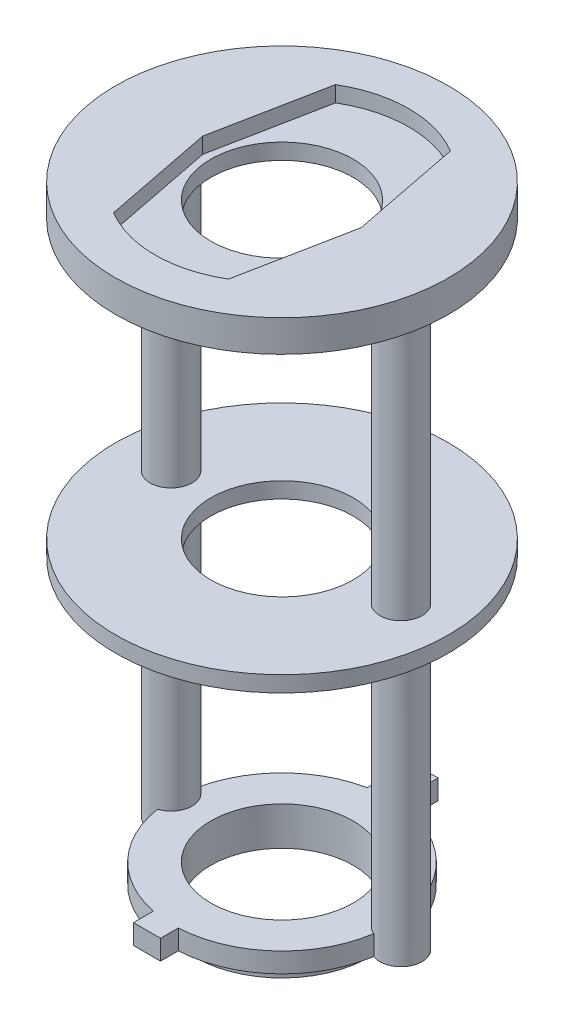
ISO-10303-21;
HEADER;
FILE_DESCRIPTION(('STEP AP214'),'2;1');
FILE_NAME('part.step','',(''),(''),'','','');
FILE_SCHEMA(('AUTOMOTIVE_DESIGN { 1 0 10303 214 1 1 1 1 }'));
ENDSEC;
DATA;
#1=APPLICATION_CONTEXT('core data for automotive mechanical design processes');
#2=APPLICATION_PROTOCOL_DEFINITION('international standard','automotive_design',2000,#1);
#3=PRODUCT_CONTEXT('',#1,'mechanical');
#4=PRODUCT('Part','Part','',(#3));
#5=PRODUCT_RELATED_PRODUCT_CATEGORY('part','',(#4));
#6=PRODUCT_DEFINITION_FORMATION('','',#4);
#7=PRODUCT_DEFINITION_CONTEXT('part definition',#1,'design');
#8=PRODUCT_DEFINITION('design','',#6,#7);
#9=PRODUCT_DEFINITION_SHAPE('','',#8);
#10=(LENGTH_UNIT() NAMED_UNIT(*) SI_UNIT(.MILLI.,.METRE.));
#11=(NAMED_UNIT(*) PLANE_ANGLE_UNIT() SI_UNIT($,.RADIAN.));
#12=(NAMED_UNIT(*) SI_UNIT($,.STERADIAN.) SOLID_ANGLE_UNIT());
#13=UNCERTAINTY_MEASURE_WITH_UNIT(LENGTH_MEASURE(1.E-05),#10,'distance_accuracy_value','');
#14=(GEOMETRIC_REPRESENTATION_CONTEXT(3) GLOBAL_UNCERTAINTY_ASSIGNED_CONTEXT((#13)) GLOBAL_UNIT_ASSIGNED_CONTEXT((#10,
#11,#12)) REPRESENTATION_CONTEXT('',''));
#15=CARTESIAN_POINT('',(0.,0.,0.));
#16=DIRECTION('',(0.,0.,1.));
#17=DIRECTION('',(1.,0.,0.));
#18=AXIS2_PLACEMENT_3D('',#15,#16,#17);
#19=CARTESIAN_POINT('',(-0.0762000000000037,2.5,1.51384));
#20=DIRECTION('',(0.,1.,0.));
#21=DIRECTION('',(0.,0.,1.));
#22=AXIS2_PLACEMENT_3D('',#19,#20,#21);
#23=PLANE('',#22);
#24=CARTESIAN_POINT('',(-0.0762000000000037,2.5,1.51384));
#25=DIRECTION('',(0.,1.,0.));
#26=DIRECTION('',(0.,0.,1.));
#27=AXIS2_PLACEMENT_3D('',#24,#25,#26);
#28=CIRCLE('',#27,8.98);
#29=CARTESIAN_POINT('',(-0.0762000000000037,2.5,10.49384));
#30=VERTEX_POINT('',#29);
#31=EDGE_CURVE('E257',#30,#30,#28,.T.);
#32=ORIENTED_EDGE('',*,*,#31,.F.);
#33=EDGE_LOOP('',(#32));
#34=FACE_BOUND('',#33,.T.);
#35=CARTESIAN_POINT('',(-0.0762000000000037,2.5,1.51384));
#36=DIRECTION('',(0.,1.,0.));
#37=DIRECTION('',(0.,0.,1.));
#38=AXIS2_PLACEMENT_3D('',#35,#36,#37);
#39=CIRCLE('',#38,13.7668);
#40=CARTESIAN_POINT('',(0.597960957999998,2.5,15.2641232422721));
#41=VERTEX_POINT('',#40);
#42=CARTESIAN_POINT('',(13.5388396547462,2.5,3.55233882013443));
#43=VERTEX_POINT('',#42);
#44=EDGE_CURVE('E59',#41,#43,#39,.T.);
#45=ORIENTED_EDGE('',*,*,#44,.T.);
#46=CARTESIAN_POINT('',(14.5034,2.5,1.0795));
#47=DIRECTION('',(0.,1.,0.));
#48=DIRECTION('',(0.,0.,1.));
#49=AXIS2_PLACEMENT_3D('',#46,#47,#48);
#50=CIRCLE('',#49,2.65430000000001);
#51=CARTESIAN_POINT('',(13.3933444870035,2.5,-1.33153406198795));
#52=VERTEX_POINT('',#51);
#53=EDGE_CURVE('E245',#52,#43,#50,.T.);
#54=ORIENTED_EDGE('',*,*,#53,.F.);
#55=CARTESIAN_POINT('',(-0.0762000000000037,2.5,1.51384));
#56=DIRECTION('',(0.,1.,0.));
#57=DIRECTION('',(0.,0.,1.));
#58=AXIS2_PLACEMENT_3D('',#55,#56,#57);
#59=CIRCLE('',#58,13.7668);
#60=CARTESIAN_POINT('',(0.597960957999996,2.5,-12.2364432422721));
#61=VERTEX_POINT('',#60);
#62=EDGE_CURVE('E188',#52,#61,#59,.T.);
#63=ORIENTED_EDGE('',*,*,#62,.T.);
#64=DIRECTION('',(0.,0.,-1.));
#65=VECTOR('',#64,1.);
#66=CARTESIAN_POINT('',(0.597960957999996,2.5,-12.2364432422721));
#67=LINE('',#66,#65);
#68=CARTESIAN_POINT('',(0.597960957999998,2.5,-17.5133));
#69=VERTEX_POINT('',#68);
#70=EDGE_CURVE('E114',#61,#69,#67,.T.);
#71=ORIENTED_EDGE('',*,*,#70,.T.);
#72=DIRECTION('',(-1.,0.,0.));
#73=VECTOR('',#72,1.);
#74=CARTESIAN_POINT('',(0.597960957999998,2.5,-17.5133));
#75=LINE('',#74,#73);
#76=CARTESIAN_POINT('',(-2.819411684,2.5,-17.5133));
#77=VERTEX_POINT('',#76);
#78=EDGE_CURVE('E269',#69,#77,#75,.T.);
#79=ORIENTED_EDGE('',*,*,#78,.T.);
#80=DIRECTION('',(0.,0.,1.));
#81=VECTOR('',#80,1.);
#82=CARTESIAN_POINT('',(-2.819411684,2.5,-17.5133));
#83=LINE('',#82,#81);
#84=CARTESIAN_POINT('',(-2.819411684,2.5,-11.9768816966612));
#85=VERTEX_POINT('',#84);
#86=EDGE_CURVE('E271',#77,#85,#83,.T.);
#87=ORIENTED_EDGE('',*,*,#86,.T.);
#88=CARTESIAN_POINT('',(-0.0762000000000037,2.5,1.51384));
#89=DIRECTION('',(0.,1.,0.));
#90=DIRECTION('',(0.,0.,1.));
#91=AXIS2_PLACEMENT_3D('',#88,#89,#90);
#92=CIRCLE('',#91,13.7668);
#93=CARTESIAN_POINT('',(-13.5330312519173,2.5,-1.39106531642952));
#94=VERTEX_POINT('',#93);
#95=EDGE_CURVE('E273',#85,#94,#92,.T.);
#96=ORIENTED_EDGE('',*,*,#95,.T.);
#97=CARTESIAN_POINT('',(-14.5034,2.5,1.0795));
#98=DIRECTION('',(0.,1.,0.));
#99=DIRECTION('',(0.,0.,1.));
#100=AXIS2_PLACEMENT_3D('',#97,#98,#99);
#101=CIRCLE('',#100,2.6543);
#102=CARTESIAN_POINT('',(-13.6834098116879,2.5,3.60396520694422));
#103=VERTEX_POINT('',#102);
#104=EDGE_CURVE('E251',#103,#94,#101,.T.);
#105=ORIENTED_EDGE('',*,*,#104,.F.);
#106=CARTESIAN_POINT('',(-0.0762000000000037,2.5,1.51384));
#107=DIRECTION('',(0.,1.,0.));
#108=DIRECTION('',(0.,0.,1.));
#109=AXIS2_PLACEMENT_3D('',#106,#107,#108);
#110=CIRCLE('',#109,13.7668);
#111=CARTESIAN_POINT('',(-2.81941168400001,2.5,15.0045616966612));
#112=VERTEX_POINT('',#111);
#113=EDGE_CURVE('E275',#103,#112,#110,.T.);
#114=ORIENTED_EDGE('',*,*,#113,.T.);
#115=DIRECTION('',(0.,0.,1.));
#116=VECTOR('',#115,1.);
#117=CARTESIAN_POINT('',(-2.81941168400001,2.5,15.0045616966612));
#118=LINE('',#117,#116);
#119=CARTESIAN_POINT('',(-2.819411684,2.5,17.5133));
#120=VERTEX_POINT('',#119);
#121=EDGE_CURVE('E142',#112,#120,#118,.T.);
#122=ORIENTED_EDGE('',*,*,#121,.T.);
#123=DIRECTION('',(1.,0.,0.));
#124=VECTOR('',#123,1.);
#125=CARTESIAN_POINT('',(-2.819411684,2.5,17.5133));
#126=LINE('',#125,#124);
#127=CARTESIAN_POINT('',(0.597960957999998,2.5,17.5133));
#128=VERTEX_POINT('',#127);
#129=EDGE_CURVE('E136',#120,#128,#126,.T.);
#130=ORIENTED_EDGE('',*,*,#129,.T.);
#131=DIRECTION('',(0.,0.,-1.));
#132=VECTOR('',#131,1.);
#133=CARTESIAN_POINT('',(0.597960957999998,2.5,17.5133));
#134=LINE('',#133,#132);
#135=EDGE_CURVE('E139',#128,#41,#134,.T.);
#136=ORIENTED_EDGE('',*,*,#135,.T.);
#137=EDGE_LOOP('',(#45,#54,#63,#71,#79,#87,#96,#105,#114,#122,#130,#136));
#138=FACE_BOUND('',#137,.T.);
#139=ADVANCED_FACE('F35',(#34,#138),#23,.T.);
#140=CARTESIAN_POINT('',(-0.0762000000000037,2.5,1.51384));
#141=DIRECTION('',(0.,-1.,0.));
#142=DIRECTION('',(0.,0.,-1.));
#143=AXIS2_PLACEMENT_3D('',#140,#141,#142);
#144=CYLINDRICAL_SURFACE('',#143,13.7668);
#145=CARTESIAN_POINT('',(-0.0762000000000037,0.,1.51384));
#146=DIRECTION('',(0.,1.,0.));
#147=DIRECTION('',(0.,0.,1.));
#148=AXIS2_PLACEMENT_3D('',#145,#146,#147);
#149=CIRCLE('',#148,13.7668);
#150=CARTESIAN_POINT('',(13.3933444870035,0.,-1.33153406198795));
#151=VERTEX_POINT('',#150);
#152=CARTESIAN_POINT('',(0.597960957999996,0.,-12.2364432422721));
#153=VERTEX_POINT('',#152);
#154=EDGE_CURVE('E164',#151,#153,#149,.T.);
#155=ORIENTED_EDGE('',*,*,#154,.T.);
#156=DIRECTION('',(0.,-1.,0.));
#157=VECTOR('',#156,1.);
#158=CARTESIAN_POINT('',(0.597960957999996,2.5,-12.2364432422721));
#159=LINE('',#158,#157);
#160=EDGE_CURVE('E212',#61,#153,#159,.T.);
#161=ORIENTED_EDGE('',*,*,#160,.F.);
#162=ORIENTED_EDGE('',*,*,#62,.F.);
#163=DIRECTION('',(0.,-1.,0.));
#164=VECTOR('',#163,1.);
#165=CARTESIAN_POINT('',(13.3933444870035,2.5,-1.33153406198795));
#166=LINE('',#165,#164);
#167=EDGE_CURVE('E160',#52,#151,#166,.T.);
#168=ORIENTED_EDGE('',*,*,#167,.T.);
#169=EDGE_LOOP('',(#155,#161,#162,#168));
#170=FACE_BOUND('',#169,.T.);
#171=ADVANCED_FACE('F37',(#170),#144,.T.);
#172=CARTESIAN_POINT('',(0.597960957999996,2.5,-12.2364432422721));
#173=DIRECTION('',(-1.,0.,0.));
#174=DIRECTION('',(0.,0.,1.));
#175=AXIS2_PLACEMENT_3D('',#172,#173,#174);
#176=PLANE('',#175);
#177=DIRECTION('',(0.,0.,-1.));
#178=VECTOR('',#177,1.);
#179=CARTESIAN_POINT('',(0.597960957999996,0.,-12.2364432422721));
#180=LINE('',#179,#178);
#181=CARTESIAN_POINT('',(0.597960957999998,0.,-17.5133));
#182=VERTEX_POINT('',#181);
#183=EDGE_CURVE('E167',#153,#182,#180,.T.);
#184=ORIENTED_EDGE('',*,*,#183,.T.);
#185=DIRECTION('',(0.,-1.,0.));
#186=VECTOR('',#185,1.);
#187=CARTESIAN_POINT('',(0.597960957999998,2.5,-17.5133));
#188=LINE('',#187,#186);
#189=EDGE_CURVE('E209',#69,#182,#188,.T.);
#190=ORIENTED_EDGE('',*,*,#189,.F.);
#191=ORIENTED_EDGE('',*,*,#70,.F.);
#192=ORIENTED_EDGE('',*,*,#160,.T.);
#193=EDGE_LOOP('',(#184,#190,#191,#192));
#194=FACE_BOUND('',#193,.T.);
#195=ADVANCED_FACE('F423',(#194),#176,.F.);
#196=CARTESIAN_POINT('',(0.597960957999998,2.5,-17.5133));
#197=DIRECTION('',(0.,0.,1.));
#198=DIRECTION('',(1.,0.,0.));
#199=AXIS2_PLACEMENT_3D('',#196,#197,#198);
#200=PLANE('',#199);
#201=DIRECTION('',(-1.,0.,0.));
#202=VECTOR('',#201,1.);
#203=CARTESIAN_POINT('',(0.597960957999998,0.,-17.5133));
#204=LINE('',#203,#202);
#205=CARTESIAN_POINT('',(-2.819411684,0.,-17.5133));
#206=VERTEX_POINT('',#205);
#207=EDGE_CURVE('E170',#182,#206,#204,.T.);
#208=ORIENTED_EDGE('',*,*,#207,.T.);
#209=DIRECTION('',(0.,-1.,0.));
#210=VECTOR('',#209,1.);
#211=CARTESIAN_POINT('',(-2.819411684,2.5,-17.5133));
#212=LINE('',#211,#210);
#213=EDGE_CURVE('E206',#77,#206,#212,.T.);
#214=ORIENTED_EDGE('',*,*,#213,.F.);
#215=ORIENTED_EDGE('',*,*,#78,.F.);
#216=ORIENTED_EDGE('',*,*,#189,.T.);
#217=EDGE_LOOP('',(#208,#214,#215,#216));
#218=FACE_BOUND('',#217,.T.);
#219=ADVANCED_FACE('F457',(#218),#200,.F.);
#220=CARTESIAN_POINT('',(-2.819411684,2.5,-17.5133));
#221=DIRECTION('',(1.,0.,0.));
#222=DIRECTION('',(0.,0.,-1.));
#223=AXIS2_PLACEMENT_3D('',#220,#221,#222);
#224=PLANE('',#223);
#225=DIRECTION('',(0.,0.,1.));
#226=VECTOR('',#225,1.);
#227=CARTESIAN_POINT('',(-2.819411684,0.,-17.5133));
#228=LINE('',#227,#226);
#229=CARTESIAN_POINT('',(-2.819411684,0.,-11.9768816966612));
#230=VERTEX_POINT('',#229);
#231=EDGE_CURVE('E172',#206,#230,#228,.T.);
#232=ORIENTED_EDGE('',*,*,#231,.T.);
#233=DIRECTION('',(0.,-1.,0.));
#234=VECTOR('',#233,1.);
#235=CARTESIAN_POINT('',(-2.819411684,2.5,-11.9768816966612));
#236=LINE('',#235,#234);
#237=EDGE_CURVE('E203',#85,#230,#236,.T.);
#238=ORIENTED_EDGE('',*,*,#237,.F.);
#239=ORIENTED_EDGE('',*,*,#86,.F.);
#240=ORIENTED_EDGE('',*,*,#213,.T.);
#241=EDGE_LOOP('',(#232,#238,#239,#240));
#242=FACE_BOUND('',#241,.T.);
#243=ADVANCED_FACE('F453',(#242),#224,.F.);
#244=CARTESIAN_POINT('',(-0.0762000000000037,2.5,1.51384));
#245=DIRECTION('',(0.,-1.,0.));
#246=DIRECTION('',(0.,0.,-1.));
#247=AXIS2_PLACEMENT_3D('',#244,#245,#246);
#248=CYLINDRICAL_SURFACE('',#247,13.7668);
#249=CARTESIAN_POINT('',(-0.0762000000000037,0.,1.51384));
#250=DIRECTION('',(0.,1.,0.));
#251=DIRECTION('',(0.,0.,1.));
#252=AXIS2_PLACEMENT_3D('',#249,#250,#251);
#253=CIRCLE('',#252,13.7668);
#254=CARTESIAN_POINT('',(-13.5330312519173,0.,-1.39106531642952));
#255=VERTEX_POINT('',#254);
#256=EDGE_CURVE('E174',#230,#255,#253,.T.);
#257=ORIENTED_EDGE('',*,*,#256,.T.);
#258=DIRECTION('',(0.,-1.,0.));
#259=VECTOR('',#258,1.);
#260=CARTESIAN_POINT('',(-13.5330312519173,2.5,-1.39106531642952));
#261=LINE('',#260,#259);
#262=EDGE_CURVE('E200',#94,#255,#261,.T.);
#263=ORIENTED_EDGE('',*,*,#262,.F.);
#264=ORIENTED_EDGE('',*,*,#95,.F.);
#265=ORIENTED_EDGE('',*,*,#237,.T.);
#266=EDGE_LOOP('',(#257,#263,#264,#265));
#267=FACE_BOUND('',#266,.T.);
#268=ADVANCED_FACE('F448',(#267),#248,.T.);
#269=CARTESIAN_POINT('',(-14.5034,2.5,1.0795));
#270=DIRECTION('',(0.,-1.,0.));
#271=DIRECTION('',(0.,0.,-1.));
#272=AXIS2_PLACEMENT_3D('',#269,#270,#271);
#273=CYLINDRICAL_SURFACE('',#272,2.6543);
#274=CARTESIAN_POINT('',(-14.5034,35.805,1.0795));
#275=DIRECTION('',(0.,-1.,0.));
#276=DIRECTION('',(0.,0.,-1.));
#277=AXIS2_PLACEMENT_3D('',#274,#275,#276);
#278=CIRCLE('',#277,2.6543);
#279=CARTESIAN_POINT('',(-14.5034,35.805,-1.5748));
#280=VERTEX_POINT('',#279);
#281=EDGE_CURVE('E218',#280,#280,#278,.T.);
#282=ORIENTED_EDGE('',*,*,#281,.T.);
#283=EDGE_LOOP('',(#282));
#284=FACE_BOUND('',#283,.T.);
#285=CARTESIAN_POINT('',(-14.5034,0.,1.0795));
#286=DIRECTION('',(0.,1.,0.));
#287=DIRECTION('',(0.,0.,1.));
#288=AXIS2_PLACEMENT_3D('',#285,#286,#287);
#289=CIRCLE('',#288,2.6543);
#290=CARTESIAN_POINT('',(-13.6834098116879,0.,3.60396520694422));
#291=VERTEX_POINT('',#290);
#292=EDGE_CURVE('E176',#255,#291,#289,.T.);
#293=ORIENTED_EDGE('',*,*,#292,.T.);
#294=DIRECTION('',(0.,-1.,0.));
#295=VECTOR('',#294,1.);
#296=CARTESIAN_POINT('',(-13.6834098116879,2.5,3.60396520694422));
#297=LINE('',#296,#295);
#298=EDGE_CURVE('E197',#103,#291,#297,.T.);
#299=ORIENTED_EDGE('',*,*,#298,.F.);
#300=ORIENTED_EDGE('',*,*,#104,.T.);
#301=ORIENTED_EDGE('',*,*,#262,.T.);
#302=EDGE_LOOP('',(#293,#299,#300,#301));
#303=FACE_BOUND('',#302,.T.);
#304=ADVANCED_FACE('F445',(#284,#303),#273,.T.);
#305=CARTESIAN_POINT('',(-0.0762000000000037,2.5,1.51384));
#306=DIRECTION('',(0.,-1.,0.));
#307=DIRECTION('',(0.,0.,-1.));
#308=AXIS2_PLACEMENT_3D('',#305,#306,#307);
#309=CYLINDRICAL_SURFACE('',#308,13.7668);
#310=CARTESIAN_POINT('',(-0.0762000000000037,0.,1.51384));
#311=DIRECTION('',(0.,1.,0.));
#312=DIRECTION('',(0.,0.,1.));
#313=AXIS2_PLACEMENT_3D('',#310,#311,#312);
#314=CIRCLE('',#313,13.7668);
#315=CARTESIAN_POINT('',(-2.81941168400001,0.,15.0045616966612));
#316=VERTEX_POINT('',#315);
#317=EDGE_CURVE('E178',#291,#316,#314,.T.);
#318=ORIENTED_EDGE('',*,*,#317,.T.);
#319=DIRECTION('',(0.,-1.,0.));
#320=VECTOR('',#319,1.);
#321=CARTESIAN_POINT('',(-2.81941168400001,2.5,15.0045616966612));
#322=LINE('',#321,#320);
#323=EDGE_CURVE('E194',#112,#316,#322,.T.);
#324=ORIENTED_EDGE('',*,*,#323,.F.);
#325=ORIENTED_EDGE('',*,*,#113,.F.);
#326=ORIENTED_EDGE('',*,*,#298,.T.);
#327=EDGE_LOOP('',(#318,#324,#325,#326));
#328=FACE_BOUND('',#327,.T.);
#329=ADVANCED_FACE('F281',(#328),#309,.T.);
#330=CARTESIAN_POINT('',(-2.81941168400001,2.5,15.0045616966612));
#331=DIRECTION('',(1.,0.,0.));
#332=DIRECTION('',(0.,0.,-1.));
#333=AXIS2_PLACEMENT_3D('',#330,#331,#332);
#334=PLANE('',#333);
#335=DIRECTION('',(0.,0.,1.));
#336=VECTOR('',#335,1.);
#337=CARTESIAN_POINT('',(-2.81941168400001,0.,15.0045616966612));
#338=LINE('',#337,#336);
#339=CARTESIAN_POINT('',(-2.819411684,0.,17.5133));
#340=VERTEX_POINT('',#339);
#341=EDGE_CURVE('E180',#316,#340,#338,.T.);
#342=ORIENTED_EDGE('',*,*,#341,.T.);
#343=DIRECTION('',(0.,-1.,0.));
#344=VECTOR('',#343,1.);
#345=CARTESIAN_POINT('',(-2.819411684,2.5,17.5133));
#346=LINE('',#345,#344);
#347=EDGE_CURVE('E154',#120,#340,#346,.T.);
#348=ORIENTED_EDGE('',*,*,#347,.F.);
#349=ORIENTED_EDGE('',*,*,#121,.F.);
#350=ORIENTED_EDGE('',*,*,#323,.T.);
#351=EDGE_LOOP('',(#342,#348,#349,#350));
#352=FACE_BOUND('',#351,.T.);
#353=ADVANCED_FACE('F285',(#352),#334,.F.);
#354=CARTESIAN_POINT('',(-2.819411684,2.5,17.5133));
#355=DIRECTION('',(0.,0.,-1.));
#356=DIRECTION('',(-1.,0.,0.));
#357=AXIS2_PLACEMENT_3D('',#354,#355,#356);
#358=PLANE('',#357);
#359=DIRECTION('',(1.,0.,0.));
#360=VECTOR('',#359,1.);
#361=CARTESIAN_POINT('',(-2.819411684,0.,17.5133));
#362=LINE('',#361,#360);
#363=CARTESIAN_POINT('',(0.597960957999998,0.,17.5133));
#364=VERTEX_POINT('',#363);
#365=EDGE_CURVE('E151',#340,#364,#362,.T.);
#366=ORIENTED_EDGE('',*,*,#365,.T.);
#367=DIRECTION('',(0.,-1.,0.));
#368=VECTOR('',#367,1.);
#369=CARTESIAN_POINT('',(0.597960957999998,2.5,17.5133));
#370=LINE('',#369,#368);
#371=EDGE_CURVE('E148',#128,#364,#370,.T.);
#372=ORIENTED_EDGE('',*,*,#371,.F.);
#373=ORIENTED_EDGE('',*,*,#129,.F.);
#374=ORIENTED_EDGE('',*,*,#347,.T.);
#375=EDGE_LOOP('',(#366,#372,#373,#374));
#376=FACE_BOUND('',#375,.T.);
#377=ADVANCED_FACE('F149',(#376),#358,.F.);
#378=CARTESIAN_POINT('',(0.597960957999998,2.5,17.5133));
#379=DIRECTION('',(-1.,0.,0.));
#380=DIRECTION('',(0.,0.,1.));
#381=AXIS2_PLACEMENT_3D('',#378,#379,#380);
#382=PLANE('',#381);
#383=DIRECTION('',(0.,0.,-1.));
#384=VECTOR('',#383,1.);
#385=CARTESIAN_POINT('',(0.597960957999998,0.,17.5133));
#386=LINE('',#385,#384);
#387=CARTESIAN_POINT('',(0.597960957999998,0.,15.2641232422721));
#388=VERTEX_POINT('',#387);
#389=EDGE_CURVE('E183',#364,#388,#386,.T.);
#390=ORIENTED_EDGE('',*,*,#389,.T.);
#391=DIRECTION('',(0.,-1.,0.));
#392=VECTOR('',#391,1.);
#393=CARTESIAN_POINT('',(0.597960957999998,2.5,15.2641232422721));
#394=LINE('',#393,#392);
#395=EDGE_CURVE('E155',#41,#388,#394,.T.);
#396=ORIENTED_EDGE('',*,*,#395,.F.);
#397=ORIENTED_EDGE('',*,*,#135,.F.);
#398=ORIENTED_EDGE('',*,*,#371,.T.);
#399=EDGE_LOOP('',(#390,#396,#397,#398));
#400=FACE_BOUND('',#399,.T.);
#401=ADVANCED_FACE('F157',(#400),#382,.F.);
#402=CARTESIAN_POINT('',(-0.0762000000000037,2.5,1.51384));
#403=DIRECTION('',(0.,-1.,0.));
#404=DIRECTION('',(0.,0.,-1.));
#405=AXIS2_PLACEMENT_3D('',#402,#403,#404);
#406=CYLINDRICAL_SURFACE('',#405,13.7668);
#407=CARTESIAN_POINT('',(-0.0762000000000037,0.,1.51384));
#408=DIRECTION('',(0.,1.,0.));
#409=DIRECTION('',(0.,0.,1.));
#410=AXIS2_PLACEMENT_3D('',#407,#408,#409);
#411=CIRCLE('',#410,13.7668);
#412=CARTESIAN_POINT('',(13.5388396547462,0.,3.55233882013443));
#413=VERTEX_POINT('',#412);
#414=EDGE_CURVE('E185',#388,#413,#411,.T.);
#415=ORIENTED_EDGE('',*,*,#414,.T.);
#416=DIRECTION('',(0.,-1.,0.));
#417=VECTOR('',#416,1.);
#418=CARTESIAN_POINT('',(13.5388396547462,2.5,3.55233882013443));
#419=LINE('',#418,#417);
#420=EDGE_CURVE('E190',#43,#413,#419,.T.);
#421=ORIENTED_EDGE('',*,*,#420,.F.);
#422=ORIENTED_EDGE('',*,*,#44,.F.);
#423=ORIENTED_EDGE('',*,*,#395,.T.);
#424=EDGE_LOOP('',(#415,#421,#422,#423));
#425=FACE_BOUND('',#424,.T.);
#426=ADVANCED_FACE('F291',(#425),#406,.T.);
#427=CARTESIAN_POINT('',(14.5034,2.5,1.0795));
#428=DIRECTION('',(0.,-1.,0.));
#429=DIRECTION('',(0.,0.,-1.));
#430=AXIS2_PLACEMENT_3D('',#427,#428,#429);
#431=CYLINDRICAL_SURFACE('',#430,2.6543);
#432=CARTESIAN_POINT('',(14.5034,35.805,1.0795));
#433=DIRECTION('',(0.,-1.,0.));
#434=DIRECTION('',(0.,0.,-1.));
#435=AXIS2_PLACEMENT_3D('',#432,#433,#434);
#436=CIRCLE('',#435,2.6543);
#437=CARTESIAN_POINT('',(14.5034,35.805,-1.57480000000001));
#438=VERTEX_POINT('',#437);
#439=EDGE_CURVE('E216',#438,#438,#436,.T.);
#440=ORIENTED_EDGE('',*,*,#439,.T.);
#441=EDGE_LOOP('',(#440));
#442=FACE_BOUND('',#441,.T.);
#443=CARTESIAN_POINT('',(14.5034,0.,1.0795));
#444=DIRECTION('',(0.,1.,0.));
#445=DIRECTION('',(0.,0.,1.));
#446=AXIS2_PLACEMENT_3D('',#443,#444,#445);
#447=CIRCLE('',#446,2.6543);
#448=EDGE_CURVE('E105',#413,#151,#447,.T.);
#449=ORIENTED_EDGE('',*,*,#448,.T.);
#450=ORIENTED_EDGE('',*,*,#167,.F.);
#451=ORIENTED_EDGE('',*,*,#53,.T.);
#452=ORIENTED_EDGE('',*,*,#420,.T.);
#453=EDGE_LOOP('',(#449,#450,#451,#452));
#454=FACE_BOUND('',#453,.T.);
#455=ADVANCED_FACE('F292',(#442,#454),#431,.T.);
#456=CARTESIAN_POINT('',(-0.0762000000000037,0.,1.51384));
#457=DIRECTION('',(0.,1.,0.));
#458=DIRECTION('',(0.,0.,1.));
#459=AXIS2_PLACEMENT_3D('',#456,#457,#458);
#460=PLANE('',#459);
#461=CARTESIAN_POINT('',(-0.0762000000000054,0.,1.51384));
#462=DIRECTION('',(0.,1.,0.));
#463=DIRECTION('',(0.,0.,1.));
#464=AXIS2_PLACEMENT_3D('',#461,#462,#463);
#465=CIRCLE('',#464,11.0744);
#466=CARTESIAN_POINT('',(-0.0762000000000054,0.,12.58824));
#467=VERTEX_POINT('',#466);
#468=EDGE_CURVE('E11',#467,#467,#465,.F.);
#469=ORIENTED_EDGE('',*,*,#468,.F.);
#470=EDGE_LOOP('',(#469));
#471=FACE_BOUND('',#470,.T.);
#472=CARTESIAN_POINT('',(14.5034,0.,1.0795));
#473=DIRECTION('',(0.,1.,0.));
#474=DIRECTION('',(0.,0.,1.));
#475=AXIS2_PLACEMENT_3D('',#472,#473,#474);
#476=CIRCLE('',#475,1.715);
#477=CARTESIAN_POINT('',(14.5034,0.,2.7945));
#478=VERTEX_POINT('',#477);
#479=EDGE_CURVE('E260',#478,#478,#476,.F.);
#480=ORIENTED_EDGE('',*,*,#479,.F.);
#481=EDGE_LOOP('',(#480));
#482=FACE_BOUND('',#481,.T.);
#483=CARTESIAN_POINT('',(-14.5034,0.,1.0795));
#484=DIRECTION('',(0.,1.,0.));
#485=DIRECTION('',(0.,0.,1.));
#486=AXIS2_PLACEMENT_3D('',#483,#484,#485);
#487=CIRCLE('',#486,1.715);
#488=CARTESIAN_POINT('',(-14.5034,0.,2.7945));
#489=VERTEX_POINT('',#488);
#490=EDGE_CURVE('E168',#489,#489,#487,.F.);
#491=ORIENTED_EDGE('',*,*,#490,.F.);
#492=EDGE_LOOP('',(#491));
#493=FACE_BOUND('',#492,.T.);
#494=ORIENTED_EDGE('',*,*,#154,.F.);
#495=ORIENTED_EDGE('',*,*,#448,.F.);
#496=ORIENTED_EDGE('',*,*,#414,.F.);
#497=ORIENTED_EDGE('',*,*,#389,.F.);
#498=ORIENTED_EDGE('',*,*,#365,.F.);
#499=ORIENTED_EDGE('',*,*,#341,.F.);
#500=ORIENTED_EDGE('',*,*,#317,.F.);
#501=ORIENTED_EDGE('',*,*,#292,.F.);
#502=ORIENTED_EDGE('',*,*,#256,.F.);
#503=ORIENTED_EDGE('',*,*,#231,.F.);
#504=ORIENTED_EDGE('',*,*,#207,.F.);
#505=ORIENTED_EDGE('',*,*,#183,.F.);
#506=EDGE_LOOP('',(#494,#495,#496,#497,#498,#499,#500,#501,#502,#503,#504,#505));
#507=FACE_BOUND('',#506,.T.);
#508=ADVANCED_FACE('F288',(#471,#482,#493,#507),#460,.F.);
#509=CARTESIAN_POINT('',(-14.5034,-0.00100000000000013,1.0795));
#510=DIRECTION('',(0.,1.,0.));
#511=DIRECTION('',(0.,0.,1.));
#512=AXIS2_PLACEMENT_3D('',#509,#510,#511);
#513=CYLINDRICAL_SURFACE('',#512,1.715);
#514=ORIENTED_EDGE('',*,*,#490,.T.);
#515=EDGE_LOOP('',(#514));
#516=FACE_BOUND('',#515,.T.);
#517=CARTESIAN_POINT('',(-14.5034,15.,1.0795));
#518=DIRECTION('',(0.,-1.,0.));
#519=DIRECTION('',(0.,0.,-1.));
#520=AXIS2_PLACEMENT_3D('',#517,#518,#519);
#521=CIRCLE('',#520,1.715);
#522=CARTESIAN_POINT('',(-14.5034,15.,-0.635500000000002));
#523=VERTEX_POINT('',#522);
#524=EDGE_CURVE('E391',#523,#523,#521,.T.);
#525=ORIENTED_EDGE('',*,*,#524,.F.);
#526=EDGE_LOOP('',(#525));
#527=FACE_BOUND('',#526,.T.);
#528=ADVANCED_FACE('F427',(#516,#527),#513,.F.);
#529=CARTESIAN_POINT('',(-0.0762000000000037,-0.00100000000000013,1.51384));
#530=DIRECTION('',(0.,1.,0.));
#531=DIRECTION('',(0.,0.,1.));
#532=AXIS2_PLACEMENT_3D('',#529,#530,#531);
#533=CYLINDRICAL_SURFACE('',#532,8.98);
#534=ORIENTED_EDGE('',*,*,#31,.T.);
#535=EDGE_LOOP('',(#534));
#536=FACE_BOUND('',#535,.T.);
#537=CARTESIAN_POINT('',(-0.0762000000000037,-2.35,1.51384));
#538=DIRECTION('',(0.,-1.,0.));
#539=DIRECTION('',(0.,0.,-1.));
#540=AXIS2_PLACEMENT_3D('',#537,#538,#539);
#541=CIRCLE('',#540,8.98);
#542=CARTESIAN_POINT('',(-0.0762000000000037,-2.35,-7.46616));
#543=VERTEX_POINT('',#542);
#544=EDGE_CURVE('E768',#543,#543,#541,.F.);
#545=ORIENTED_EDGE('',*,*,#544,.F.);
#546=EDGE_LOOP('',(#545));
#547=FACE_BOUND('',#546,.T.);
#548=ADVANCED_FACE('F536',(#536,#547),#533,.F.);
#549=CARTESIAN_POINT('',(14.5034,-0.00100000000000013,1.0795));
#550=DIRECTION('',(0.,1.,0.));
#551=DIRECTION('',(0.,0.,1.));
#552=AXIS2_PLACEMENT_3D('',#549,#550,#551);
#553=CYLINDRICAL_SURFACE('',#552,1.715);
#554=ORIENTED_EDGE('',*,*,#479,.T.);
#555=EDGE_LOOP('',(#554));
#556=FACE_BOUND('',#555,.T.);
#557=CARTESIAN_POINT('',(14.5034,15.,1.0795));
#558=DIRECTION('',(0.,-1.,0.));
#559=DIRECTION('',(0.,0.,-1.));
#560=AXIS2_PLACEMENT_3D('',#557,#558,#559);
#561=CIRCLE('',#560,1.715);
#562=CARTESIAN_POINT('',(14.5034,15.,-0.635500000000003));
#563=VERTEX_POINT('',#562);
#564=EDGE_CURVE('E381',#563,#563,#561,.T.);
#565=ORIENTED_EDGE('',*,*,#564,.F.);
#566=EDGE_LOOP('',(#565));
#567=FACE_BOUND('',#566,.T.);
#568=ADVANCED_FACE('F542',(#556,#567),#553,.F.);
#569=CARTESIAN_POINT('',(-0.0762000000000037,35.805,1.51384));
#570=DIRECTION('',(0.,-1.,0.));
#571=DIRECTION('',(0.,0.,-1.));
#572=AXIS2_PLACEMENT_3D('',#569,#570,#571);
#573=PLANE('',#572);
#574=ORIENTED_EDGE('',*,*,#281,.F.);
#575=EDGE_LOOP('',(#574));
#576=FACE_BOUND('',#575,.T.);
#577=ORIENTED_EDGE('',*,*,#439,.F.);
#578=EDGE_LOOP('',(#577));
#579=FACE_BOUND('',#578,.T.);
#580=CARTESIAN_POINT('',(-0.0762000000000037,35.805,1.51384));
#581=DIRECTION('',(0.,-1.,0.));
#582=DIRECTION('',(0.,0.,-1.));
#583=AXIS2_PLACEMENT_3D('',#580,#581,#582);
#584=CIRCLE('',#583,21.);
#585=CARTESIAN_POINT('',(-0.0762000000000037,35.805,-19.48616));
#586=VERTEX_POINT('',#585);
#587=EDGE_CURVE('E219',#586,#586,#584,.T.);
#588=ORIENTED_EDGE('',*,*,#587,.T.);
#589=EDGE_LOOP('',(#588));
#590=FACE_BOUND('',#589,.T.);
#591=CARTESIAN_POINT('',(-0.0762000000000037,35.805,1.51384));
#592=DIRECTION('',(0.,-1.,0.));
#593=DIRECTION('',(0.,0.,-1.));
#594=AXIS2_PLACEMENT_3D('',#591,#592,#593);
#595=CIRCLE('',#594,8.98);
#596=CARTESIAN_POINT('',(-0.0762000000000037,35.805,-7.46616));
#597=VERTEX_POINT('',#596);
#598=EDGE_CURVE('E231',#597,#597,#595,.T.);
#599=ORIENTED_EDGE('',*,*,#598,.F.);
#600=EDGE_LOOP('',(#599));
#601=FACE_BOUND('',#600,.T.);
#602=ADVANCED_FACE('F545',(#576,#579,#590,#601),#573,.T.);
#603=CARTESIAN_POINT('',(-0.0762000000000037,37.805,1.51384));
#604=DIRECTION('',(0.,-1.,0.));
#605=DIRECTION('',(0.,0.,-1.));
#606=AXIS2_PLACEMENT_3D('',#603,#604,#605);
#607=PLANE('',#606);
#608=CARTESIAN_POINT('',(-14.5034,37.805,1.0795));
#609=DIRECTION('',(0.,-1.,0.));
#610=DIRECTION('',(0.,0.,-1.));
#611=AXIS2_PLACEMENT_3D('',#608,#609,#610);
#612=CIRCLE('',#611,2.6543);
#613=CARTESIAN_POINT('',(-14.5034,37.805,-1.5748));
#614=VERTEX_POINT('',#613);
#615=EDGE_CURVE('E43',#614,#614,#612,.T.);
#616=ORIENTED_EDGE('',*,*,#615,.T.);
#617=EDGE_LOOP('',(#616));
#618=FACE_BOUND('',#617,.T.);
#619=CARTESIAN_POINT('',(14.5034,37.805,1.0795));
#620=DIRECTION('',(0.,-1.,0.));
#621=DIRECTION('',(0.,0.,-1.));
#622=AXIS2_PLACEMENT_3D('',#619,#620,#621);
#623=CIRCLE('',#622,2.6543);
#624=CARTESIAN_POINT('',(14.5034,37.805,-1.57480000000001));
#625=VERTEX_POINT('',#624);
#626=EDGE_CURVE('E214',#625,#625,#623,.T.);
#627=ORIENTED_EDGE('',*,*,#626,.T.);
#628=EDGE_LOOP('',(#627));
#629=FACE_BOUND('',#628,.T.);
#630=CARTESIAN_POINT('',(-0.0762000000000037,37.805,1.51384));
#631=DIRECTION('',(0.,-1.,0.));
#632=DIRECTION('',(0.,0.,-1.));
#633=AXIS2_PLACEMENT_3D('',#630,#631,#632);
#634=CIRCLE('',#633,21.);
#635=CARTESIAN_POINT('',(-0.0762000000000037,37.805,-19.48616));
#636=VERTEX_POINT('',#635);
#637=EDGE_CURVE('E226',#636,#636,#634,.T.);
#638=ORIENTED_EDGE('',*,*,#637,.F.);
#639=EDGE_LOOP('',(#638));
#640=FACE_BOUND('',#639,.T.);
#641=CARTESIAN_POINT('',(-0.0762000000000037,37.805,1.51384));
#642=DIRECTION('',(0.,-1.,0.));
#643=DIRECTION('',(0.,0.,-1.));
#644=AXIS2_PLACEMENT_3D('',#641,#642,#643);
#645=CIRCLE('',#644,8.98);
#646=CARTESIAN_POINT('',(-0.0762000000000037,37.805,-7.46616));
#647=VERTEX_POINT('',#646);
#648=EDGE_CURVE('E234',#647,#647,#645,.T.);
#649=ORIENTED_EDGE('',*,*,#648,.T.);
#650=EDGE_LOOP('',(#649));
#651=FACE_BOUND('',#650,.T.);
#652=ADVANCED_FACE('F399',(#618,#629,#640,#651),#607,.F.);
#653=CARTESIAN_POINT('',(-0.0762000000000037,35.805,1.51384));
#654=DIRECTION('',(0.,1.,0.));
#655=DIRECTION('',(0.,0.,1.));
#656=AXIS2_PLACEMENT_3D('',#653,#654,#655);
#657=CYLINDRICAL_SURFACE('',#656,21.);
#658=ORIENTED_EDGE('',*,*,#587,.F.);
#659=EDGE_LOOP('',(#658));
#660=FACE_BOUND('',#659,.T.);
#661=ORIENTED_EDGE('',*,*,#637,.T.);
#662=EDGE_LOOP('',(#661));
#663=FACE_BOUND('',#662,.T.);
#664=ADVANCED_FACE('F404',(#660,#663),#657,.T.);
#665=CARTESIAN_POINT('',(-0.0762000000000037,35.805,1.51384));
#666=DIRECTION('',(0.,1.,0.));
#667=DIRECTION('',(0.,0.,1.));
#668=AXIS2_PLACEMENT_3D('',#665,#666,#667);
#669=CYLINDRICAL_SURFACE('',#668,8.98);
#670=ORIENTED_EDGE('',*,*,#598,.T.);
#671=EDGE_LOOP('',(#670));
#672=FACE_BOUND('',#671,.T.);
#673=ORIENTED_EDGE('',*,*,#648,.F.);
#674=EDGE_LOOP('',(#673));
#675=FACE_BOUND('',#674,.T.);
#676=ADVANCED_FACE('F401',(#672,#675),#669,.F.);
#677=CARTESIAN_POINT('',(-0.0762000000000037,76.805,1.51384));
#678=DIRECTION('',(0.,1.,0.));
#679=DIRECTION('',(0.,0.,1.));
#680=AXIS2_PLACEMENT_3D('',#677,#678,#679);
#681=PLANE('',#680);
#682=CARTESIAN_POINT('',(-0.0762000000000017,76.805,-0.345535000000039));
#683=DIRECTION('',(0.,1.,0.));
#684=DIRECTION('',(0.,0.,-1.));
#685=AXIS2_PLACEMENT_3D('',#682,#683,#684);
#686=CIRCLE('',#685,14.140625);
#687=CARTESIAN_POINT('',(7.1738,76.805,-12.48616));
#688=VERTEX_POINT('',#687);
#689=CARTESIAN_POINT('',(-7.32620000000001,76.805,-12.48616));
#690=VERTEX_POINT('',#689);
#691=EDGE_CURVE('E50',#688,#690,#686,.T.);
#692=ORIENTED_EDGE('',*,*,#691,.F.);
#693=DIRECTION('',(-0.192745304030928,0.,-0.981248820521087));
#694=VECTOR('',#693,1.);
#695=CARTESIAN_POINT('',(9.9238,76.805,1.51384));
#696=LINE('',#695,#694);
#697=CARTESIAN_POINT('',(9.9238,76.805,1.51384));
#698=VERTEX_POINT('',#697);
#699=EDGE_CURVE('E352',#698,#688,#696,.T.);
#700=ORIENTED_EDGE('',*,*,#699,.F.);
#701=DIRECTION('',(0.192745304030928,0.,-0.981248820521087));
#702=VECTOR('',#701,1.);
#703=CARTESIAN_POINT('',(7.1738,76.805,15.51384));
#704=LINE('',#703,#702);
#705=CARTESIAN_POINT('',(7.17379999999999,76.805,15.51384));
#706=VERTEX_POINT('',#705);
#707=EDGE_CURVE('E355',#706,#698,#704,.T.);
#708=ORIENTED_EDGE('',*,*,#707,.F.);
#709=CARTESIAN_POINT('',(-0.0762000000000089,76.805,3.37321499999991));
#710=DIRECTION('',(0.,1.,0.));
#711=DIRECTION('',(0.,0.,1.));
#712=AXIS2_PLACEMENT_3D('',#709,#710,#711);
#713=CIRCLE('',#712,14.1406250000001);
#714=CARTESIAN_POINT('',(-7.32620000000001,76.805,15.51384));
#715=VERTEX_POINT('',#714);
#716=EDGE_CURVE('E374',#715,#706,#713,.T.);
#717=ORIENTED_EDGE('',*,*,#716,.F.);
#718=DIRECTION('',(0.192745304030928,0.,0.981248820521087));
#719=VECTOR('',#718,1.);
#720=CARTESIAN_POINT('',(-10.0762,76.805,1.51384));
#721=LINE('',#720,#719);
#722=CARTESIAN_POINT('',(-10.0762,76.805,1.51384));
#723=VERTEX_POINT('',#722);
#724=EDGE_CURVE('E371',#723,#715,#721,.T.);
#725=ORIENTED_EDGE('',*,*,#724,.F.);
#726=DIRECTION('',(-0.192745304030928,0.,0.981248820521087));
#727=VECTOR('',#726,1.);
#728=CARTESIAN_POINT('',(-7.32620000000001,76.805,-12.48616));
#729=LINE('',#728,#727);
#730=EDGE_CURVE('E369',#690,#723,#729,.T.);
#731=ORIENTED_EDGE('',*,*,#730,.F.);
#732=EDGE_LOOP('',(#692,#700,#708,#717,#725,#731));
#733=FACE_BOUND('',#732,.T.);
#734=CARTESIAN_POINT('',(-0.0762000000000037,76.805,1.51384));
#735=DIRECTION('',(0.,1.,0.));
#736=DIRECTION('',(0.,0.,1.));
#737=AXIS2_PLACEMENT_3D('',#734,#735,#736);
#738=CIRCLE('',#737,21.);
#739=CARTESIAN_POINT('',(-0.0762000000000037,76.805,22.51384));
#740=VERTEX_POINT('',#739);
#741=EDGE_CURVE('E242',#740,#740,#738,.T.);
#742=ORIENTED_EDGE('',*,*,#741,.T.);
#743=EDGE_LOOP('',(#742));
#744=FACE_BOUND('',#743,.T.);
#745=ADVANCED_FACE('F403',(#733,#744),#681,.T.);
#746=CARTESIAN_POINT('',(-0.0762000000000037,76.805,1.51384));
#747=DIRECTION('',(0.,-1.,0.));
#748=DIRECTION('',(0.,0.,-1.));
#749=AXIS2_PLACEMENT_3D('',#746,#747,#748);
#750=CYLINDRICAL_SURFACE('',#749,8.98);
#751=CARTESIAN_POINT('',(-0.0762000000000037,74.805,1.51384));
#752=DIRECTION('',(0.,1.,0.));
#753=DIRECTION('',(0.,0.,1.));
#754=AXIS2_PLACEMENT_3D('',#751,#752,#753);
#755=CIRCLE('',#754,8.98);
#756=CARTESIAN_POINT('',(-0.0762000000000037,74.805,10.49384));
#757=VERTEX_POINT('',#756);
#758=EDGE_CURVE('E358',#757,#757,#755,.T.);
#759=ORIENTED_EDGE('',*,*,#758,.T.);
#760=EDGE_LOOP('',(#759));
#761=FACE_BOUND('',#760,.T.);
#762=CARTESIAN_POINT('',(-0.0762000000000037,72.805,1.51384));
#763=DIRECTION('',(0.,1.,0.));
#764=DIRECTION('',(0.,0.,1.));
#765=AXIS2_PLACEMENT_3D('',#762,#763,#764);
#766=CIRCLE('',#765,8.98);
#767=CARTESIAN_POINT('',(-0.0762000000000037,72.805,10.49384));
#768=VERTEX_POINT('',#767);
#769=EDGE_CURVE('E223',#768,#768,#766,.T.);
#770=ORIENTED_EDGE('',*,*,#769,.F.);
#771=EDGE_LOOP('',(#770));
#772=FACE_BOUND('',#771,.T.);
#773=ADVANCED_FACE('F410',(#761,#772),#750,.F.);
#774=CARTESIAN_POINT('',(-0.0762000000000037,76.805,1.51384));
#775=DIRECTION('',(0.,-1.,0.));
#776=DIRECTION('',(0.,0.,-1.));
#777=AXIS2_PLACEMENT_3D('',#774,#775,#776);
#778=CYLINDRICAL_SURFACE('',#777,21.);
#779=ORIENTED_EDGE('',*,*,#741,.F.);
#780=EDGE_LOOP('',(#779));
#781=FACE_BOUND('',#780,.T.);
#782=CARTESIAN_POINT('',(-0.0762000000000037,72.805,1.51384));
#783=DIRECTION('',(0.,1.,0.));
#784=DIRECTION('',(0.,0.,1.));
#785=AXIS2_PLACEMENT_3D('',#782,#783,#784);
#786=CIRCLE('',#785,21.);
#787=CARTESIAN_POINT('',(-0.0762000000000037,72.805,22.51384));
#788=VERTEX_POINT('',#787);
#789=EDGE_CURVE('E241',#788,#788,#786,.T.);
#790=ORIENTED_EDGE('',*,*,#789,.T.);
#791=EDGE_LOOP('',(#790));
#792=FACE_BOUND('',#791,.T.);
#793=ADVANCED_FACE('F577',(#781,#792),#778,.T.);
#794=CARTESIAN_POINT('',(-14.5034,72.805,1.0795));
#795=DIRECTION('',(0.,1.,0.));
#796=DIRECTION('',(0.,0.,1.));
#797=AXIS2_PLACEMENT_3D('',#794,#795,#796);
#798=CIRCLE('',#797,2.6543);
#799=CARTESIAN_POINT('',(-14.5034,72.805,3.7338));
#800=VERTEX_POINT('',#799);
#801=EDGE_CURVE('E254',#800,#800,#798,.T.);
#802=ORIENTED_EDGE('',*,*,#801,.F.);
#803=EDGE_LOOP('',(#802));
#804=FACE_BOUND('',#803,.T.);
#805=ORIENTED_EDGE('',*,*,#615,.F.);
#806=EDGE_LOOP('',(#805));
#807=FACE_BOUND('',#806,.T.);
#808=ADVANCED_FACE('F450',(#804,#807),#273,.T.);
#809=CARTESIAN_POINT('',(-0.0762000000000037,72.805,1.51384));
#810=DIRECTION('',(0.,1.,0.));
#811=DIRECTION('',(0.,0.,1.));
#812=AXIS2_PLACEMENT_3D('',#809,#810,#811);
#813=PLANE('',#812);
#814=ORIENTED_EDGE('',*,*,#801,.T.);
#815=EDGE_LOOP('',(#814));
#816=FACE_BOUND('',#815,.T.);
#817=CARTESIAN_POINT('',(14.5034,72.805,1.0795));
#818=DIRECTION('',(0.,1.,0.));
#819=DIRECTION('',(0.,0.,1.));
#820=AXIS2_PLACEMENT_3D('',#817,#818,#819);
#821=CIRCLE('',#820,2.65430000000001);
#822=CARTESIAN_POINT('',(14.5034,72.805,3.7338));
#823=VERTEX_POINT('',#822);
#824=EDGE_CURVE('E248',#823,#823,#821,.T.);
#825=ORIENTED_EDGE('',*,*,#824,.T.);
#826=EDGE_LOOP('',(#825));
#827=FACE_BOUND('',#826,.T.);
#828=ORIENTED_EDGE('',*,*,#789,.F.);
#829=EDGE_LOOP('',(#828));
#830=FACE_BOUND('',#829,.T.);
#831=ORIENTED_EDGE('',*,*,#769,.T.);
#832=EDGE_LOOP('',(#831));
#833=FACE_BOUND('',#832,.T.);
#834=ADVANCED_FACE('F576',(#816,#827,#830,#833),#813,.F.);
#835=ORIENTED_EDGE('',*,*,#824,.F.);
#836=EDGE_LOOP('',(#835));
#837=FACE_BOUND('',#836,.T.);
#838=ORIENTED_EDGE('',*,*,#626,.F.);
#839=EDGE_LOOP('',(#838));
#840=FACE_BOUND('',#839,.T.);
#841=ADVANCED_FACE('F434',(#837,#840),#431,.T.);
#842=CARTESIAN_POINT('',(-14.5034,15.,1.0795));
#843=DIRECTION('',(0.,-1.,0.));
#844=DIRECTION('',(0.,0.,-1.));
#845=AXIS2_PLACEMENT_3D('',#842,#843,#844);
#846=PLANE('',#845);
#847=ORIENTED_EDGE('',*,*,#524,.T.);
#848=EDGE_LOOP('',(#847));
#849=FACE_BOUND('',#848,.T.);
#850=ADVANCED_FACE('F588',(#849),#846,.T.);
#851=CARTESIAN_POINT('',(14.5034,15.,1.0795));
#852=DIRECTION('',(0.,-1.,0.));
#853=DIRECTION('',(0.,0.,-1.));
#854=AXIS2_PLACEMENT_3D('',#851,#852,#853);
#855=PLANE('',#854);
#856=ORIENTED_EDGE('',*,*,#564,.T.);
#857=EDGE_LOOP('',(#856));
#858=FACE_BOUND('',#857,.T.);
#859=ADVANCED_FACE('F598',(#858),#855,.T.);
#860=CARTESIAN_POINT('',(-0.0762000000000017,74.805,-0.345535000000039));
#861=DIRECTION('',(0.,1.,0.));
#862=DIRECTION('',(0.,0.,1.));
#863=AXIS2_PLACEMENT_3D('',#860,#861,#862);
#864=CYLINDRICAL_SURFACE('',#863,14.140625);
#865=ORIENTED_EDGE('',*,*,#691,.T.);
#866=DIRECTION('',(0.,1.,0.));
#867=VECTOR('',#866,1.);
#868=CARTESIAN_POINT('',(-7.32620000000001,74.805,-12.48616));
#869=LINE('',#868,#867);
#870=CARTESIAN_POINT('',(-7.32620000000001,74.805,-12.48616));
#871=VERTEX_POINT('',#870);
#872=EDGE_CURVE('E329',#871,#690,#869,.T.);
#873=ORIENTED_EDGE('',*,*,#872,.F.);
#874=CARTESIAN_POINT('',(-0.0762000000000017,74.805,-0.345535000000039));
#875=DIRECTION('',(0.,1.,0.));
#876=DIRECTION('',(0.,0.,-1.));
#877=AXIS2_PLACEMENT_3D('',#874,#875,#876);
#878=CIRCLE('',#877,14.140625);
#879=CARTESIAN_POINT('',(7.1738,74.805,-12.48616));
#880=VERTEX_POINT('',#879);
#881=EDGE_CURVE('E333',#880,#871,#878,.T.);
#882=ORIENTED_EDGE('',*,*,#881,.F.);
#883=DIRECTION('',(0.,1.,0.));
#884=VECTOR('',#883,1.);
#885=CARTESIAN_POINT('',(7.1738,74.805,-12.48616));
#886=LINE('',#885,#884);
#887=EDGE_CURVE('E379',#880,#688,#886,.T.);
#888=ORIENTED_EDGE('',*,*,#887,.T.);
#889=EDGE_LOOP('',(#865,#873,#882,#888));
#890=FACE_BOUND('',#889,.T.);
#891=ADVANCED_FACE('F331',(#890),#864,.F.);
#892=CARTESIAN_POINT('',(9.9238,74.805,1.51384));
#893=DIRECTION('',(0.981248820521087,0.,-0.192745304030928));
#894=DIRECTION('',(-0.192745304030928,0.,-0.981248820521087));
#895=AXIS2_PLACEMENT_3D('',#892,#893,#894);
#896=PLANE('',#895);
#897=ORIENTED_EDGE('',*,*,#699,.T.);
#898=ORIENTED_EDGE('',*,*,#887,.F.);
#899=DIRECTION('',(-0.192745304030928,0.,-0.981248820521087));
#900=VECTOR('',#899,1.);
#901=CARTESIAN_POINT('',(9.9238,74.805,1.51384));
#902=LINE('',#901,#900);
#903=CARTESIAN_POINT('',(9.9238,74.805,1.51384));
#904=VERTEX_POINT('',#903);
#905=EDGE_CURVE('E339',#904,#880,#902,.T.);
#906=ORIENTED_EDGE('',*,*,#905,.F.);
#907=DIRECTION('',(0.,1.,0.));
#908=VECTOR('',#907,1.);
#909=CARTESIAN_POINT('',(9.9238,74.805,1.51384));
#910=LINE('',#909,#908);
#911=EDGE_CURVE('E382',#904,#698,#910,.T.);
#912=ORIENTED_EDGE('',*,*,#911,.T.);
#913=EDGE_LOOP('',(#897,#898,#906,#912));
#914=FACE_BOUND('',#913,.T.);
#915=ADVANCED_FACE('F613',(#914),#896,.F.);
#916=CARTESIAN_POINT('',(7.1738,74.805,15.51384));
#917=DIRECTION('',(0.981248820521087,0.,0.192745304030928));
#918=DIRECTION('',(0.192745304030928,0.,-0.981248820521087));
#919=AXIS2_PLACEMENT_3D('',#916,#917,#918);
#920=PLANE('',#919);
#921=ORIENTED_EDGE('',*,*,#707,.T.);
#922=ORIENTED_EDGE('',*,*,#911,.F.);
#923=DIRECTION('',(0.192745304030928,0.,-0.981248820521087));
#924=VECTOR('',#923,1.);
#925=CARTESIAN_POINT('',(7.1738,74.805,15.51384));
#926=LINE('',#925,#924);
#927=CARTESIAN_POINT('',(7.17379999999999,74.805,15.51384));
#928=VERTEX_POINT('',#927);
#929=EDGE_CURVE('E365',#928,#904,#926,.T.);
#930=ORIENTED_EDGE('',*,*,#929,.F.);
#931=DIRECTION('',(0.,1.,0.));
#932=VECTOR('',#931,1.);
#933=CARTESIAN_POINT('',(7.17379999999999,74.805,15.51384));
#934=LINE('',#933,#932);
#935=EDGE_CURVE('E384',#928,#706,#934,.T.);
#936=ORIENTED_EDGE('',*,*,#935,.T.);
#937=EDGE_LOOP('',(#921,#922,#930,#936));
#938=FACE_BOUND('',#937,.T.);
#939=ADVANCED_FACE('F621',(#938),#920,.F.);
#940=CARTESIAN_POINT('',(-0.0762000000000089,74.805,3.37321499999991));
#941=DIRECTION('',(0.,1.,0.));
#942=DIRECTION('',(0.,0.,1.));
#943=AXIS2_PLACEMENT_3D('',#940,#941,#942);
#944=CYLINDRICAL_SURFACE('',#943,14.1406250000001);
#945=ORIENTED_EDGE('',*,*,#716,.T.);
#946=ORIENTED_EDGE('',*,*,#935,.F.);
#947=CARTESIAN_POINT('',(-0.0762000000000089,74.805,3.37321499999991));
#948=DIRECTION('',(0.,1.,0.));
#949=DIRECTION('',(0.,0.,1.));
#950=AXIS2_PLACEMENT_3D('',#947,#948,#949);
#951=CIRCLE('',#950,14.1406250000001);
#952=CARTESIAN_POINT('',(-7.32620000000001,74.805,15.51384));
#953=VERTEX_POINT('',#952);
#954=EDGE_CURVE('E362',#953,#928,#951,.T.);
#955=ORIENTED_EDGE('',*,*,#954,.F.);
#956=DIRECTION('',(0.,1.,0.));
#957=VECTOR('',#956,1.);
#958=CARTESIAN_POINT('',(-7.32620000000001,74.805,15.51384));
#959=LINE('',#958,#957);
#960=EDGE_CURVE('E386',#953,#715,#959,.T.);
#961=ORIENTED_EDGE('',*,*,#960,.T.);
#962=EDGE_LOOP('',(#945,#946,#955,#961));
#963=FACE_BOUND('',#962,.T.);
#964=ADVANCED_FACE('F629',(#963),#944,.F.);
#965=CARTESIAN_POINT('',(-10.0762,74.805,1.51384));
#966=DIRECTION('',(-0.981248820521087,0.,0.192745304030928));
#967=DIRECTION('',(0.192745304030928,0.,0.981248820521087));
#968=AXIS2_PLACEMENT_3D('',#965,#966,#967);
#969=PLANE('',#968);
#970=ORIENTED_EDGE('',*,*,#724,.T.);
#971=ORIENTED_EDGE('',*,*,#960,.F.);
#972=DIRECTION('',(0.192745304030928,0.,0.981248820521087));
#973=VECTOR('',#972,1.);
#974=CARTESIAN_POINT('',(-10.0762,74.805,1.51384));
#975=LINE('',#974,#973);
#976=CARTESIAN_POINT('',(-10.0762,74.805,1.51384));
#977=VERTEX_POINT('',#976);
#978=EDGE_CURVE('E347',#977,#953,#975,.T.);
#979=ORIENTED_EDGE('',*,*,#978,.F.);
#980=DIRECTION('',(0.,1.,0.));
#981=VECTOR('',#980,1.);
#982=CARTESIAN_POINT('',(-10.0762,74.805,1.51384));
#983=LINE('',#982,#981);
#984=EDGE_CURVE('E338',#977,#723,#983,.T.);
#985=ORIENTED_EDGE('',*,*,#984,.T.);
#986=EDGE_LOOP('',(#970,#971,#979,#985));
#987=FACE_BOUND('',#986,.T.);
#988=ADVANCED_FACE('F637',(#987),#969,.F.);
#989=CARTESIAN_POINT('',(-7.32620000000001,74.805,-12.48616));
#990=DIRECTION('',(-0.981248820521087,0.,-0.192745304030928));
#991=DIRECTION('',(-0.192745304030928,0.,0.981248820521087));
#992=AXIS2_PLACEMENT_3D('',#989,#990,#991);
#993=PLANE('',#992);
#994=ORIENTED_EDGE('',*,*,#730,.T.);
#995=ORIENTED_EDGE('',*,*,#984,.F.);
#996=DIRECTION('',(-0.192745304030928,0.,0.981248820521087));
#997=VECTOR('',#996,1.);
#998=CARTESIAN_POINT('',(-7.32620000000001,74.805,-12.48616));
#999=LINE('',#998,#997);
#1000=EDGE_CURVE('E342',#871,#977,#999,.T.);
#1001=ORIENTED_EDGE('',*,*,#1000,.F.);
#1002=ORIENTED_EDGE('',*,*,#872,.T.);
#1003=EDGE_LOOP('',(#994,#995,#1001,#1002));
#1004=FACE_BOUND('',#1003,.T.);
#1005=ADVANCED_FACE('F343',(#1004),#993,.F.);
#1006=CARTESIAN_POINT('',(-0.0762000000000017,74.805,-0.345535000000039));
#1007=DIRECTION('',(0.,-1.,0.));
#1008=DIRECTION('',(0.,0.,-1.));
#1009=AXIS2_PLACEMENT_3D('',#1006,#1007,#1008);
#1010=PLANE('',#1009);
#1011=ORIENTED_EDGE('',*,*,#758,.F.);
#1012=EDGE_LOOP('',(#1011));
#1013=FACE_BOUND('',#1012,.T.);
#1014=ORIENTED_EDGE('',*,*,#881,.T.);
#1015=ORIENTED_EDGE('',*,*,#1000,.T.);
#1016=ORIENTED_EDGE('',*,*,#978,.T.);
#1017=ORIENTED_EDGE('',*,*,#954,.T.);
#1018=ORIENTED_EDGE('',*,*,#929,.T.);
#1019=ORIENTED_EDGE('',*,*,#905,.T.);
#1020=EDGE_LOOP('',(#1014,#1015,#1016,#1017,#1018,#1019));
#1021=FACE_BOUND('',#1020,.T.);
#1022=ADVANCED_FACE('F349',(#1013,#1021),#1010,.F.);
#1023=CARTESIAN_POINT('',(-0.0762000000000054,-2.35,1.51384));
#1024=DIRECTION('',(0.,1.,0.));
#1025=DIRECTION('',(0.,0.,1.));
#1026=AXIS2_PLACEMENT_3D('',#1023,#1024,#1025);
#1027=CYLINDRICAL_SURFACE('',#1026,11.0744);
#1028=CARTESIAN_POINT('',(-0.0762000000000054,-2.35,1.51384));
#1029=DIRECTION('',(0.,-1.,0.));
#1030=DIRECTION('',(0.,0.,-1.));
#1031=AXIS2_PLACEMENT_3D('',#1028,#1029,#1030);
#1032=CIRCLE('',#1031,11.0744);
#1033=CARTESIAN_POINT('',(-0.0762000000000054,-2.35,-9.56056000000001));
#1034=VERTEX_POINT('',#1033);
#1035=EDGE_CURVE('E766',#1034,#1034,#1032,.T.);
#1036=ORIENTED_EDGE('',*,*,#1035,.F.);
#1037=EDGE_LOOP('',(#1036));
#1038=FACE_BOUND('',#1037,.T.);
#1039=ORIENTED_EDGE('',*,*,#468,.T.);
#1040=EDGE_LOOP('',(#1039));
#1041=FACE_BOUND('',#1040,.T.);
#1042=ADVANCED_FACE('F657',(#1038,#1041),#1027,.T.);
#1043=CARTESIAN_POINT('',(0.,-2.35,0.));
#1044=DIRECTION('',(0.,-1.,0.));
#1045=DIRECTION('',(0.,0.,-1.));
#1046=AXIS2_PLACEMENT_3D('',#1043,#1044,#1045);
#1047=PLANE('',#1046);
#1048=ORIENTED_EDGE('',*,*,#544,.T.);
#1049=EDGE_LOOP('',(#1048));
#1050=FACE_BOUND('',#1049,.T.);
#1051=ORIENTED_EDGE('',*,*,#1035,.T.);
#1052=EDGE_LOOP('',(#1051));
#1053=FACE_BOUND('',#1052,.T.);
#1054=ADVANCED_FACE('F670',(#1050,#1053),#1047,.T.);
#1055=CLOSED_SHELL('',(#139,#171,#195,#219,#243,#268,#304,#329,#353,#377,#401,#426,#455,#508,
#528,#548,#568,#602,#652,#664,#676,#745,#773,#793,#808,#834,#841,#850,#859,#891,#915,#939,#964,
#988,#1005,#1022,#1042,#1054));
#1056=MANIFOLD_SOLID_BREP('B2',#1055);
#1057=ADVANCED_BREP_SHAPE_REPRESENTATION('',(#18,#1056),#14);
#1058=SHAPE_DEFINITION_REPRESENTATION(#9,#1057);
ENDSEC;
END-ISO-10303-21;
